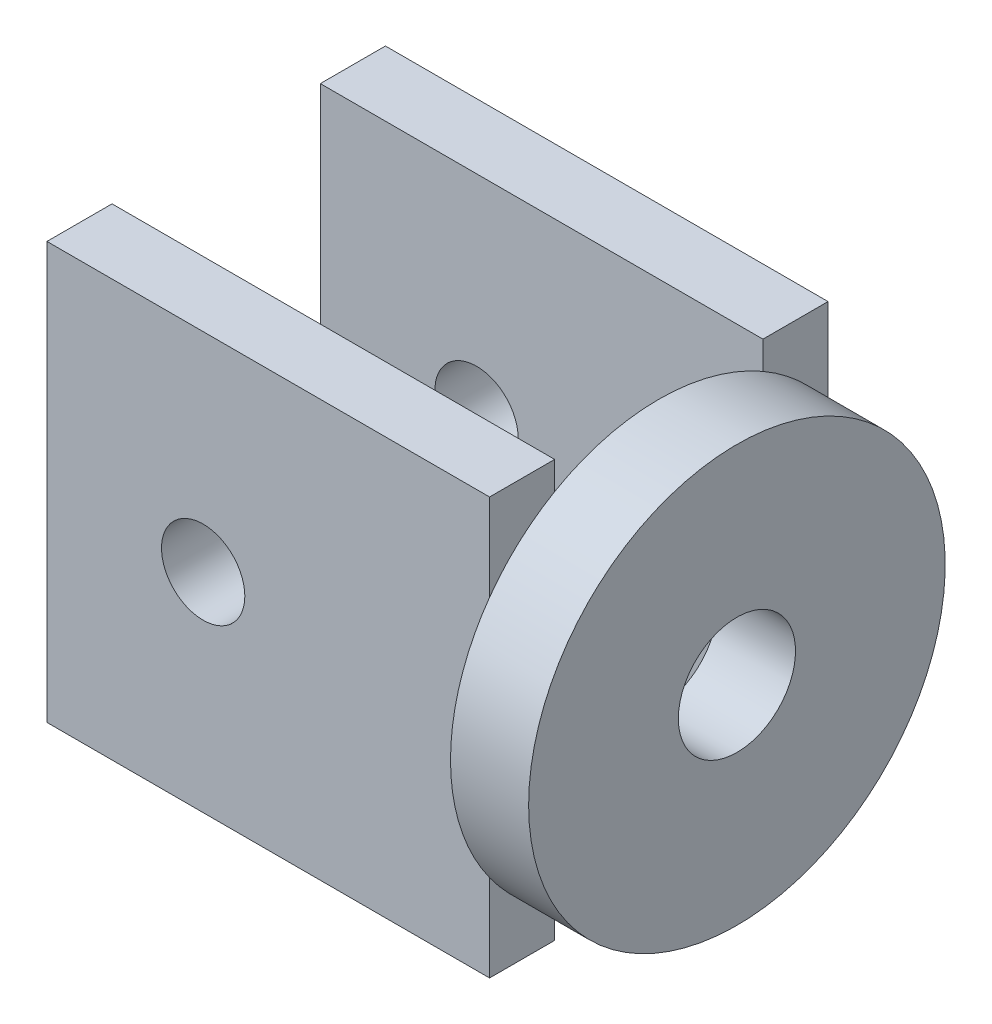
ISO-10303-21;
HEADER;
FILE_DESCRIPTION(('STEP AP214'),'2;1');
FILE_NAME('part.step','',(''),(''),'','','');
FILE_SCHEMA(('AUTOMOTIVE_DESIGN { 1 0 10303 214 1 1 1 1 }'));
ENDSEC;
DATA;
#1=APPLICATION_CONTEXT('core data for automotive mechanical design processes');
#2=APPLICATION_PROTOCOL_DEFINITION('international standard','automotive_design',2000,#1);
#3=PRODUCT_CONTEXT('',#1,'mechanical');
#4=PRODUCT('Part','Part','',(#3));
#5=PRODUCT_RELATED_PRODUCT_CATEGORY('part','',(#4));
#6=PRODUCT_DEFINITION_FORMATION('','',#4);
#7=PRODUCT_DEFINITION_CONTEXT('part definition',#1,'design');
#8=PRODUCT_DEFINITION('design','',#6,#7);
#9=PRODUCT_DEFINITION_SHAPE('','',#8);
#10=(LENGTH_UNIT() NAMED_UNIT(*) SI_UNIT(.MILLI.,.METRE.));
#11=(NAMED_UNIT(*) PLANE_ANGLE_UNIT() SI_UNIT($,.RADIAN.));
#12=(NAMED_UNIT(*) SI_UNIT($,.STERADIAN.) SOLID_ANGLE_UNIT());
#13=UNCERTAINTY_MEASURE_WITH_UNIT(LENGTH_MEASURE(1.E-05),#10,'distance_accuracy_value','');
#14=(GEOMETRIC_REPRESENTATION_CONTEXT(3) GLOBAL_UNCERTAINTY_ASSIGNED_CONTEXT((#13)) GLOBAL_UNIT_ASSIGNED_CONTEXT((#10,
#11,#12)) REPRESENTATION_CONTEXT('',''));
#15=CARTESIAN_POINT('',(0.,0.,0.));
#16=DIRECTION('',(0.,0.,1.));
#17=DIRECTION('',(1.,0.,0.));
#18=AXIS2_PLACEMENT_3D('',#15,#16,#17);
#19=CARTESIAN_POINT('',(-3.,-8.,6.5));
#20=DIRECTION('',(-1.,0.,0.));
#21=DIRECTION('',(0.,0.,1.));
#22=AXIS2_PLACEMENT_3D('',#19,#20,#21);
#23=PLANE('',#22);
#24=DIRECTION('',(0.,1.,0.));
#25=VECTOR('',#24,1.);
#26=CARTESIAN_POINT('',(-3.,-9.,-4.));
#27=LINE('',#26,#25);
#28=CARTESIAN_POINT('',(-3.,6.92820323027551,-4.));
#29=VERTEX_POINT('',#28);
#30=CARTESIAN_POINT('',(-3.,8.,-4.));
#31=VERTEX_POINT('',#30);
#32=EDGE_CURVE('E138',#29,#31,#27,.T.);
#33=ORIENTED_EDGE('',*,*,#32,.F.);
#34=CARTESIAN_POINT('',(-3.00000000000011,0.,0.));
#35=DIRECTION('',(-1.,0.,0.));
#36=DIRECTION('',(0.,0.,1.));
#37=AXIS2_PLACEMENT_3D('',#34,#35,#36);
#38=CIRCLE('',#37,8.);
#39=CARTESIAN_POINT('',(-3.00000000000011,4.66368952654441,-6.5));
#40=VERTEX_POINT('',#39);
#41=EDGE_CURVE('E166',#29,#40,#38,.T.);
#42=ORIENTED_EDGE('',*,*,#41,.T.);
#43=DIRECTION('',(0.,1.,0.));
#44=VECTOR('',#43,1.);
#45=CARTESIAN_POINT('',(-3.,-8.,-6.5));
#46=LINE('',#45,#44);
#47=CARTESIAN_POINT('',(-3.,8.,-6.5));
#48=VERTEX_POINT('',#47);
#49=EDGE_CURVE('E220',#40,#48,#46,.T.);
#50=ORIENTED_EDGE('',*,*,#49,.T.);
#51=DIRECTION('',(0.,0.,-1.));
#52=VECTOR('',#51,1.);
#53=CARTESIAN_POINT('',(-3.,8.,6.5));
#54=LINE('',#53,#52);
#55=EDGE_CURVE('E225',#31,#48,#54,.T.);
#56=ORIENTED_EDGE('',*,*,#55,.F.);
#57=EDGE_LOOP('',(#33,#42,#50,#56));
#58=FACE_BOUND('',#57,.T.);
#59=ADVANCED_FACE('F41',(#58),#23,.F.);
#60=CARTESIAN_POINT('',(-3.,-8.,-4.));
#61=VERTEX_POINT('',#60);
#62=CARTESIAN_POINT('',(-3.,-6.92820323027551,-4.));
#63=VERTEX_POINT('',#62);
#64=EDGE_CURVE('E191',#61,#63,#27,.T.);
#65=ORIENTED_EDGE('',*,*,#64,.F.);
#66=DIRECTION('',(0.,0.,-1.));
#67=VECTOR('',#66,1.);
#68=CARTESIAN_POINT('',(-3.,-8.,6.5));
#69=LINE('',#68,#67);
#70=CARTESIAN_POINT('',(-3.,-8.,-6.5));
#71=VERTEX_POINT('',#70);
#72=EDGE_CURVE('E152',#61,#71,#69,.T.);
#73=ORIENTED_EDGE('',*,*,#72,.T.);
#74=CARTESIAN_POINT('',(-3.00000000000011,-4.66368952654441,-6.5));
#75=VERTEX_POINT('',#74);
#76=EDGE_CURVE('E218',#71,#75,#46,.T.);
#77=ORIENTED_EDGE('',*,*,#76,.T.);
#78=EDGE_CURVE('E256',#75,#63,#38,.T.);
#79=ORIENTED_EDGE('',*,*,#78,.T.);
#80=EDGE_LOOP('',(#65,#73,#77,#79));
#81=FACE_BOUND('',#80,.T.);
#82=ADVANCED_FACE('F259',(#81),#23,.F.);
#83=CARTESIAN_POINT('',(-20.,8.,6.5));
#84=DIRECTION('',(1.,0.,0.));
#85=DIRECTION('',(0.,0.,-1.));
#86=AXIS2_PLACEMENT_3D('',#83,#84,#85);
#87=PLANE('',#86);
#88=DIRECTION('',(0.,-1.,0.));
#89=VECTOR('',#88,1.);
#90=CARTESIAN_POINT('',(-20.,8.,-4.));
#91=LINE('',#90,#89);
#92=CARTESIAN_POINT('',(-20.,8.,-4.));
#93=VERTEX_POINT('',#92);
#94=CARTESIAN_POINT('',(-20.,-8.,-4.));
#95=VERTEX_POINT('',#94);
#96=EDGE_CURVE('E146',#93,#95,#91,.T.);
#97=ORIENTED_EDGE('',*,*,#96,.F.);
#98=DIRECTION('',(0.,0.,-1.));
#99=VECTOR('',#98,1.);
#100=CARTESIAN_POINT('',(-20.,8.,6.5));
#101=LINE('',#100,#99);
#102=CARTESIAN_POINT('',(-20.,8.,-6.5));
#103=VERTEX_POINT('',#102);
#104=EDGE_CURVE('E215',#93,#103,#101,.T.);
#105=ORIENTED_EDGE('',*,*,#104,.T.);
#106=DIRECTION('',(0.,-1.,0.));
#107=VECTOR('',#106,1.);
#108=CARTESIAN_POINT('',(-20.,8.,-6.5));
#109=LINE('',#108,#107);
#110=CARTESIAN_POINT('',(-20.,-8.,-6.5));
#111=VERTEX_POINT('',#110);
#112=EDGE_CURVE('E201',#103,#111,#109,.T.);
#113=ORIENTED_EDGE('',*,*,#112,.T.);
#114=DIRECTION('',(0.,0.,-1.));
#115=VECTOR('',#114,1.);
#116=CARTESIAN_POINT('',(-20.,-8.,6.5));
#117=LINE('',#116,#115);
#118=EDGE_CURVE('E153',#95,#111,#117,.T.);
#119=ORIENTED_EDGE('',*,*,#118,.F.);
#120=EDGE_LOOP('',(#97,#105,#113,#119));
#121=FACE_BOUND('',#120,.T.);
#122=ADVANCED_FACE('F235',(#121),#87,.F.);
#123=CARTESIAN_POINT('',(-20.,-8.,6.5));
#124=DIRECTION('',(0.,1.,0.));
#125=DIRECTION('',(0.,0.,1.));
#126=AXIS2_PLACEMENT_3D('',#123,#124,#125);
#127=PLANE('',#126);
#128=DIRECTION('',(1.,0.,0.));
#129=VECTOR('',#128,1.);
#130=CARTESIAN_POINT('',(-20.,-8.,-4.));
#131=LINE('',#130,#129);
#132=EDGE_CURVE('E198',#95,#61,#131,.T.);
#133=ORIENTED_EDGE('',*,*,#132,.F.);
#134=ORIENTED_EDGE('',*,*,#118,.T.);
#135=DIRECTION('',(1.,0.,0.));
#136=VECTOR('',#135,1.);
#137=CARTESIAN_POINT('',(-20.,-8.,-6.5));
#138=LINE('',#137,#136);
#139=EDGE_CURVE('E213',#111,#71,#138,.T.);
#140=ORIENTED_EDGE('',*,*,#139,.T.);
#141=ORIENTED_EDGE('',*,*,#72,.F.);
#142=EDGE_LOOP('',(#133,#134,#140,#141));
#143=FACE_BOUND('',#142,.T.);
#144=ADVANCED_FACE('F249',(#143),#127,.F.);
#145=CARTESIAN_POINT('',(-3.,8.,6.5));
#146=DIRECTION('',(0.,-1.,0.));
#147=DIRECTION('',(0.,0.,-1.));
#148=AXIS2_PLACEMENT_3D('',#145,#146,#147);
#149=PLANE('',#148);
#150=DIRECTION('',(-1.,0.,0.));
#151=VECTOR('',#150,1.);
#152=CARTESIAN_POINT('',(-3.,8.,-4.));
#153=LINE('',#152,#151);
#154=EDGE_CURVE('E11',#31,#93,#153,.T.);
#155=ORIENTED_EDGE('',*,*,#154,.F.);
#156=ORIENTED_EDGE('',*,*,#55,.T.);
#157=DIRECTION('',(-1.,0.,0.));
#158=VECTOR('',#157,1.);
#159=CARTESIAN_POINT('',(-3.,8.,-6.5));
#160=LINE('',#159,#158);
#161=EDGE_CURVE('E207',#48,#103,#160,.T.);
#162=ORIENTED_EDGE('',*,*,#161,.T.);
#163=ORIENTED_EDGE('',*,*,#104,.F.);
#164=EDGE_LOOP('',(#155,#156,#162,#163));
#165=FACE_BOUND('',#164,.T.);
#166=ADVANCED_FACE('F238',(#165),#149,.F.);
#167=CARTESIAN_POINT('',(-3.,8.,0.));
#168=DIRECTION('',(1.,0.,0.));
#169=DIRECTION('',(0.,0.,-1.));
#170=AXIS2_PLACEMENT_3D('',#167,#168,#169);
#171=PLANE('',#170);
#172=DIRECTION('',(0.,1.,0.));
#173=VECTOR('',#172,1.);
#174=CARTESIAN_POINT('',(-3.,-8.,6.5));
#175=LINE('',#174,#173);
#176=CARTESIAN_POINT('',(-3.00000000000011,-4.66368952654441,6.5));
#177=VERTEX_POINT('',#176);
#178=CARTESIAN_POINT('',(-3.,4.66368952654441,6.5));
#179=VERTEX_POINT('',#178);
#180=EDGE_CURVE('E171',#177,#179,#175,.T.);
#181=ORIENTED_EDGE('',*,*,#180,.F.);
#182=EDGE_CURVE('E162',#177,#179,#38,.T.);
#183=ORIENTED_EDGE('',*,*,#182,.T.);
#184=EDGE_LOOP('',(#181,#183));
#185=FACE_BOUND('',#184,.T.);
#186=ADVANCED_FACE('F280',(#185),#171,.F.);
#187=EDGE_CURVE('E272',#40,#75,#38,.T.);
#188=ORIENTED_EDGE('',*,*,#187,.T.);
#189=EDGE_CURVE('E175',#75,#40,#46,.T.);
#190=ORIENTED_EDGE('',*,*,#189,.T.);
#191=EDGE_LOOP('',(#188,#190));
#192=FACE_BOUND('',#191,.T.);
#193=ADVANCED_FACE('F43',(#192),#171,.F.);
#194=CARTESIAN_POINT('',(0.,0.,0.));
#195=DIRECTION('',(-1.,0.,0.));
#196=DIRECTION('',(0.,0.,1.));
#197=AXIS2_PLACEMENT_3D('',#194,#195,#196);
#198=PLANE('',#197);
#199=CARTESIAN_POINT('',(0.,0.,0.));
#200=DIRECTION('',(-1.,0.,0.));
#201=DIRECTION('',(0.,0.,1.));
#202=AXIS2_PLACEMENT_3D('',#199,#200,#201);
#203=CIRCLE('',#202,2.25);
#204=CARTESIAN_POINT('',(0.,0.,2.25));
#205=VERTEX_POINT('',#204);
#206=EDGE_CURVE('E176',#205,#205,#203,.F.);
#207=ORIENTED_EDGE('',*,*,#206,.F.);
#208=EDGE_LOOP('',(#207));
#209=FACE_BOUND('',#208,.T.);
#210=CARTESIAN_POINT('',(0.,0.,0.));
#211=DIRECTION('',(-1.,0.,0.));
#212=DIRECTION('',(0.,0.,1.));
#213=AXIS2_PLACEMENT_3D('',#210,#211,#212);
#214=CIRCLE('',#213,8.);
#215=CARTESIAN_POINT('',(0.,0.,8.));
#216=VERTEX_POINT('',#215);
#217=EDGE_CURVE('E168',#216,#216,#214,.T.);
#218=ORIENTED_EDGE('',*,*,#217,.F.);
#219=EDGE_LOOP('',(#218));
#220=FACE_BOUND('',#219,.T.);
#221=ADVANCED_FACE('F289',(#209,#220),#198,.F.);
#222=CARTESIAN_POINT('',(-3000.,0.,0.));
#223=DIRECTION('',(-1.,0.,0.));
#224=DIRECTION('',(0.,0.,1.));
#225=AXIS2_PLACEMENT_3D('',#222,#223,#224);
#226=CYLINDRICAL_SURFACE('',#225,8.);
#227=CARTESIAN_POINT('',(-3.,6.92820323027551,4.));
#228=VERTEX_POINT('',#227);
#229=EDGE_CURVE('E161',#179,#228,#38,.T.);
#230=ORIENTED_EDGE('',*,*,#229,.F.);
#231=ORIENTED_EDGE('',*,*,#182,.F.);
#232=CARTESIAN_POINT('',(-3.,-6.92820323027551,4.));
#233=VERTEX_POINT('',#232);
#234=EDGE_CURVE('E69',#233,#177,#38,.T.);
#235=ORIENTED_EDGE('',*,*,#234,.F.);
#236=EDGE_CURVE('E275',#63,#233,#38,.T.);
#237=ORIENTED_EDGE('',*,*,#236,.F.);
#238=ORIENTED_EDGE('',*,*,#78,.F.);
#239=ORIENTED_EDGE('',*,*,#187,.F.);
#240=ORIENTED_EDGE('',*,*,#41,.F.);
#241=EDGE_CURVE('E170',#228,#29,#38,.T.);
#242=ORIENTED_EDGE('',*,*,#241,.F.);
#243=EDGE_LOOP('',(#230,#231,#235,#237,#238,#239,#240,#242));
#244=FACE_BOUND('',#243,.T.);
#245=ORIENTED_EDGE('',*,*,#217,.T.);
#246=EDGE_LOOP('',(#245));
#247=FACE_BOUND('',#246,.T.);
#248=ADVANCED_FACE('F269',(#244,#247),#226,.T.);
#249=ORIENTED_EDGE('',*,*,#229,.T.);
#250=DIRECTION('',(0.,1.,0.));
#251=VECTOR('',#250,1.);
#252=CARTESIAN_POINT('',(-3.,-9.,4.));
#253=LINE('',#252,#251);
#254=CARTESIAN_POINT('',(-3.,8.,4.));
#255=VERTEX_POINT('',#254);
#256=EDGE_CURVE('E142',#228,#255,#253,.T.);
#257=ORIENTED_EDGE('',*,*,#256,.T.);
#258=CARTESIAN_POINT('',(-3.,8.,6.5));
#259=VERTEX_POINT('',#258);
#260=EDGE_CURVE('E159',#259,#255,#54,.T.);
#261=ORIENTED_EDGE('',*,*,#260,.F.);
#262=EDGE_CURVE('E206',#179,#259,#175,.T.);
#263=ORIENTED_EDGE('',*,*,#262,.F.);
#264=EDGE_LOOP('',(#249,#257,#261,#263));
#265=FACE_BOUND('',#264,.T.);
#266=ADVANCED_FACE('F284',(#265),#23,.F.);
#267=CARTESIAN_POINT('',(-3.,-8.,6.5));
#268=VERTEX_POINT('',#267);
#269=CARTESIAN_POINT('',(-3.,-8.,4.));
#270=VERTEX_POINT('',#269);
#271=EDGE_CURVE('E147',#268,#270,#69,.T.);
#272=ORIENTED_EDGE('',*,*,#271,.T.);
#273=EDGE_CURVE('E134',#270,#233,#253,.T.);
#274=ORIENTED_EDGE('',*,*,#273,.T.);
#275=ORIENTED_EDGE('',*,*,#234,.T.);
#276=EDGE_CURVE('E155',#268,#177,#175,.T.);
#277=ORIENTED_EDGE('',*,*,#276,.F.);
#278=EDGE_LOOP('',(#272,#274,#275,#277));
#279=FACE_BOUND('',#278,.T.);
#280=ADVANCED_FACE('F154',(#279),#23,.F.);
#281=CARTESIAN_POINT('',(-20.,8.,6.5));
#282=VERTEX_POINT('',#281);
#283=CARTESIAN_POINT('',(-20.,8.,4.));
#284=VERTEX_POINT('',#283);
#285=EDGE_CURVE('E224',#282,#284,#101,.T.);
#286=ORIENTED_EDGE('',*,*,#285,.T.);
#287=DIRECTION('',(0.,-1.,0.));
#288=VECTOR('',#287,1.);
#289=CARTESIAN_POINT('',(-20.,8.,4.));
#290=LINE('',#289,#288);
#291=CARTESIAN_POINT('',(-20.,-8.,4.));
#292=VERTEX_POINT('',#291);
#293=EDGE_CURVE('E59',#284,#292,#290,.T.);
#294=ORIENTED_EDGE('',*,*,#293,.T.);
#295=CARTESIAN_POINT('',(-20.,-8.,6.5));
#296=VERTEX_POINT('',#295);
#297=EDGE_CURVE('E149',#296,#292,#117,.T.);
#298=ORIENTED_EDGE('',*,*,#297,.F.);
#299=DIRECTION('',(0.,-1.,0.));
#300=VECTOR('',#299,1.);
#301=CARTESIAN_POINT('',(-20.,8.,6.5));
#302=LINE('',#301,#300);
#303=EDGE_CURVE('E202',#282,#296,#302,.T.);
#304=ORIENTED_EDGE('',*,*,#303,.F.);
#305=EDGE_LOOP('',(#286,#294,#298,#304));
#306=FACE_BOUND('',#305,.T.);
#307=ADVANCED_FACE('F306',(#306),#87,.F.);
#308=ORIENTED_EDGE('',*,*,#297,.T.);
#309=DIRECTION('',(1.,0.,0.));
#310=VECTOR('',#309,1.);
#311=CARTESIAN_POINT('',(-20.,-8.,4.));
#312=LINE('',#311,#310);
#313=EDGE_CURVE('E133',#292,#270,#312,.T.);
#314=ORIENTED_EDGE('',*,*,#313,.T.);
#315=ORIENTED_EDGE('',*,*,#271,.F.);
#316=DIRECTION('',(1.,0.,0.));
#317=VECTOR('',#316,1.);
#318=CARTESIAN_POINT('',(-20.,-8.,6.5));
#319=LINE('',#318,#317);
#320=EDGE_CURVE('E205',#296,#268,#319,.T.);
#321=ORIENTED_EDGE('',*,*,#320,.F.);
#322=EDGE_LOOP('',(#308,#314,#315,#321));
#323=FACE_BOUND('',#322,.T.);
#324=ADVANCED_FACE('F143',(#323),#127,.F.);
#325=ORIENTED_EDGE('',*,*,#260,.T.);
#326=DIRECTION('',(-1.,0.,0.));
#327=VECTOR('',#326,1.);
#328=CARTESIAN_POINT('',(-3.,8.,4.));
#329=LINE('',#328,#327);
#330=EDGE_CURVE('E49',#255,#284,#329,.T.);
#331=ORIENTED_EDGE('',*,*,#330,.T.);
#332=ORIENTED_EDGE('',*,*,#285,.F.);
#333=DIRECTION('',(-1.,0.,0.));
#334=VECTOR('',#333,1.);
#335=CARTESIAN_POINT('',(-3.,8.,6.5));
#336=LINE('',#335,#334);
#337=EDGE_CURVE('E208',#259,#282,#336,.T.);
#338=ORIENTED_EDGE('',*,*,#337,.F.);
#339=EDGE_LOOP('',(#325,#331,#332,#338));
#340=FACE_BOUND('',#339,.T.);
#341=ADVANCED_FACE('F313',(#340),#149,.F.);
#342=CARTESIAN_POINT('',(0.,0.,6.5));
#343=DIRECTION('',(0.,0.,1.));
#344=DIRECTION('',(1.,0.,0.));
#345=AXIS2_PLACEMENT_3D('',#342,#343,#344);
#346=PLANE('',#345);
#347=CARTESIAN_POINT('',(-14.,0.,6.5));
#348=DIRECTION('',(0.,0.,1.));
#349=DIRECTION('',(1.,0.,0.));
#350=AXIS2_PLACEMENT_3D('',#347,#348,#349);
#351=CIRCLE('',#350,1.6);
#352=CARTESIAN_POINT('',(-12.4,0.,6.5));
#353=VERTEX_POINT('',#352);
#354=EDGE_CURVE('E188',#353,#353,#351,.T.);
#355=ORIENTED_EDGE('',*,*,#354,.F.);
#356=EDGE_LOOP('',(#355));
#357=FACE_BOUND('',#356,.T.);
#358=ORIENTED_EDGE('',*,*,#303,.T.);
#359=ORIENTED_EDGE('',*,*,#320,.T.);
#360=ORIENTED_EDGE('',*,*,#276,.T.);
#361=ORIENTED_EDGE('',*,*,#180,.T.);
#362=ORIENTED_EDGE('',*,*,#262,.T.);
#363=ORIENTED_EDGE('',*,*,#337,.T.);
#364=EDGE_LOOP('',(#358,#359,#360,#361,#362,#363));
#365=FACE_BOUND('',#364,.T.);
#366=ADVANCED_FACE('F282',(#357,#365),#346,.T.);
#367=CARTESIAN_POINT('',(0.,0.,-6.5));
#368=DIRECTION('',(0.,0.,1.));
#369=DIRECTION('',(1.,0.,0.));
#370=AXIS2_PLACEMENT_3D('',#367,#368,#369);
#371=PLANE('',#370);
#372=CARTESIAN_POINT('',(-14.,0.,-6.5));
#373=DIRECTION('',(0.,0.,1.));
#374=DIRECTION('',(1.,0.,0.));
#375=AXIS2_PLACEMENT_3D('',#372,#373,#374);
#376=CIRCLE('',#375,1.6);
#377=CARTESIAN_POINT('',(-12.4,0.,-6.5));
#378=VERTEX_POINT('',#377);
#379=EDGE_CURVE('E179',#378,#378,#376,.T.);
#380=ORIENTED_EDGE('',*,*,#379,.T.);
#381=EDGE_LOOP('',(#380));
#382=FACE_BOUND('',#381,.T.);
#383=ORIENTED_EDGE('',*,*,#112,.F.);
#384=ORIENTED_EDGE('',*,*,#161,.F.);
#385=ORIENTED_EDGE('',*,*,#49,.F.);
#386=ORIENTED_EDGE('',*,*,#189,.F.);
#387=ORIENTED_EDGE('',*,*,#76,.F.);
#388=ORIENTED_EDGE('',*,*,#139,.F.);
#389=EDGE_LOOP('',(#383,#384,#385,#386,#387,#388));
#390=FACE_BOUND('',#389,.T.);
#391=ADVANCED_FACE('F242',(#382,#390),#371,.F.);
#392=CARTESIAN_POINT('',(-3.,-9.,-4.));
#393=DIRECTION('',(1.,0.,0.));
#394=DIRECTION('',(0.,0.,-1.));
#395=AXIS2_PLACEMENT_3D('',#392,#393,#394);
#396=PLANE('',#395);
#397=CARTESIAN_POINT('',(-3.00000000000011,0.,0.));
#398=DIRECTION('',(1.,0.,0.));
#399=DIRECTION('',(0.,0.,-1.));
#400=AXIS2_PLACEMENT_3D('',#397,#398,#399);
#401=CIRCLE('',#400,2.25);
#402=CARTESIAN_POINT('',(-3.00000000000011,0.,-2.25));
#403=VERTEX_POINT('',#402);
#404=EDGE_CURVE('E44',#403,#403,#401,.F.);
#405=ORIENTED_EDGE('',*,*,#404,.F.);
#406=EDGE_LOOP('',(#405));
#407=FACE_BOUND('',#406,.T.);
#408=EDGE_CURVE('E137',#233,#228,#253,.T.);
#409=ORIENTED_EDGE('',*,*,#408,.T.);
#410=ORIENTED_EDGE('',*,*,#241,.T.);
#411=EDGE_CURVE('E194',#63,#29,#27,.T.);
#412=ORIENTED_EDGE('',*,*,#411,.F.);
#413=ORIENTED_EDGE('',*,*,#236,.T.);
#414=EDGE_LOOP('',(#409,#410,#412,#413));
#415=FACE_BOUND('',#414,.T.);
#416=ADVANCED_FACE('F345',(#407,#415),#396,.F.);
#417=CARTESIAN_POINT('',(0.,0.,-4.));
#418=DIRECTION('',(0.,0.,1.));
#419=DIRECTION('',(1.,0.,0.));
#420=AXIS2_PLACEMENT_3D('',#417,#418,#419);
#421=PLANE('',#420);
#422=CARTESIAN_POINT('',(-14.,0.,-4.));
#423=DIRECTION('',(0.,0.,1.));
#424=DIRECTION('',(1.,0.,0.));
#425=AXIS2_PLACEMENT_3D('',#422,#423,#424);
#426=CIRCLE('',#425,1.6);
#427=CARTESIAN_POINT('',(-12.4,0.,-4.));
#428=VERTEX_POINT('',#427);
#429=EDGE_CURVE('E174',#428,#428,#426,.T.);
#430=ORIENTED_EDGE('',*,*,#429,.F.);
#431=EDGE_LOOP('',(#430));
#432=FACE_BOUND('',#431,.T.);
#433=ORIENTED_EDGE('',*,*,#132,.T.);
#434=ORIENTED_EDGE('',*,*,#64,.T.);
#435=ORIENTED_EDGE('',*,*,#411,.T.);
#436=ORIENTED_EDGE('',*,*,#32,.T.);
#437=ORIENTED_EDGE('',*,*,#154,.T.);
#438=ORIENTED_EDGE('',*,*,#96,.T.);
#439=EDGE_LOOP('',(#433,#434,#435,#436,#437,#438));
#440=FACE_BOUND('',#439,.T.);
#441=ADVANCED_FACE('F251',(#432,#440),#421,.T.);
#442=CARTESIAN_POINT('',(0.,0.,4.));
#443=DIRECTION('',(0.,0.,1.));
#444=DIRECTION('',(1.,0.,0.));
#445=AXIS2_PLACEMENT_3D('',#442,#443,#444);
#446=PLANE('',#445);
#447=CARTESIAN_POINT('',(-14.,0.,4.));
#448=DIRECTION('',(0.,0.,1.));
#449=DIRECTION('',(1.,0.,0.));
#450=AXIS2_PLACEMENT_3D('',#447,#448,#449);
#451=CIRCLE('',#450,1.6);
#452=CARTESIAN_POINT('',(-12.4,0.,4.));
#453=VERTEX_POINT('',#452);
#454=EDGE_CURVE('E173',#453,#453,#451,.T.);
#455=ORIENTED_EDGE('',*,*,#454,.T.);
#456=EDGE_LOOP('',(#455));
#457=FACE_BOUND('',#456,.T.);
#458=ORIENTED_EDGE('',*,*,#293,.F.);
#459=ORIENTED_EDGE('',*,*,#330,.F.);
#460=ORIENTED_EDGE('',*,*,#256,.F.);
#461=ORIENTED_EDGE('',*,*,#408,.F.);
#462=ORIENTED_EDGE('',*,*,#273,.F.);
#463=ORIENTED_EDGE('',*,*,#313,.F.);
#464=EDGE_LOOP('',(#458,#459,#460,#461,#462,#463));
#465=FACE_BOUND('',#464,.T.);
#466=ADVANCED_FACE('F135',(#457,#465),#446,.F.);
#467=CARTESIAN_POINT('',(-14.,0.,-8.5));
#468=DIRECTION('',(0.,0.,1.));
#469=DIRECTION('',(1.,0.,0.));
#470=AXIS2_PLACEMENT_3D('',#467,#468,#469);
#471=CYLINDRICAL_SURFACE('',#470,1.6);
#472=ORIENTED_EDGE('',*,*,#354,.T.);
#473=EDGE_LOOP('',(#472));
#474=FACE_BOUND('',#473,.T.);
#475=ORIENTED_EDGE('',*,*,#454,.F.);
#476=EDGE_LOOP('',(#475));
#477=FACE_BOUND('',#476,.T.);
#478=ADVANCED_FACE('F365',(#474,#477),#471,.F.);
#479=ORIENTED_EDGE('',*,*,#429,.T.);
#480=EDGE_LOOP('',(#479));
#481=FACE_BOUND('',#480,.T.);
#482=ORIENTED_EDGE('',*,*,#379,.F.);
#483=EDGE_LOOP('',(#482));
#484=FACE_BOUND('',#483,.T.);
#485=ADVANCED_FACE('F369',(#481,#484),#471,.F.);
#486=CARTESIAN_POINT('',(-3000.,0.,0.));
#487=DIRECTION('',(-1.,0.,0.));
#488=DIRECTION('',(0.,0.,1.));
#489=AXIS2_PLACEMENT_3D('',#486,#487,#488);
#490=CYLINDRICAL_SURFACE('',#489,2.25);
#491=ORIENTED_EDGE('',*,*,#404,.T.);
#492=EDGE_LOOP('',(#491));
#493=FACE_BOUND('',#492,.T.);
#494=ORIENTED_EDGE('',*,*,#206,.T.);
#495=EDGE_LOOP('',(#494));
#496=FACE_BOUND('',#495,.T.);
#497=ADVANCED_FACE('F378',(#493,#496),#490,.F.);
#498=CLOSED_SHELL('',(#59,#82,#122,#144,#166,#186,#193,#221,#248,#266,#280,#307,#324,#341,#366,
#391,#416,#441,#466,#478,#485,#497));
#499=MANIFOLD_SOLID_BREP('B2',#498);
#500=ADVANCED_BREP_SHAPE_REPRESENTATION('',(#18,#499),#14);
#501=SHAPE_DEFINITION_REPRESENTATION(#9,#500);
ENDSEC;
END-ISO-10303-21;
